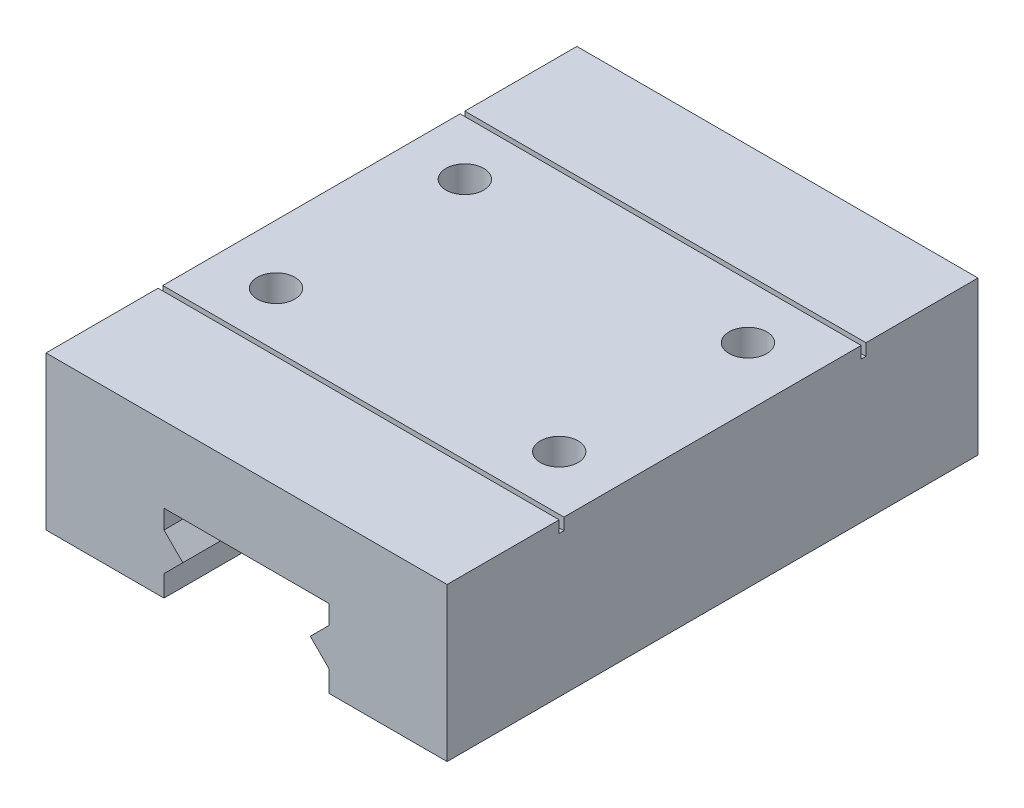
ISO-10303-21;
HEADER;
FILE_DESCRIPTION(('STEP AP214'),'2;1');
FILE_NAME('part.step','',(''),(''),'','','');
FILE_SCHEMA(('AUTOMOTIVE_DESIGN { 1 0 10303 214 1 1 1 1 }'));
ENDSEC;
DATA;
#1=APPLICATION_CONTEXT('core data for automotive mechanical design processes');
#2=APPLICATION_PROTOCOL_DEFINITION('international standard','automotive_design',2000,#1);
#3=PRODUCT_CONTEXT('',#1,'mechanical');
#4=PRODUCT('Part','Part','',(#3));
#5=PRODUCT_RELATED_PRODUCT_CATEGORY('part','',(#4));
#6=PRODUCT_DEFINITION_FORMATION('','',#4);
#7=PRODUCT_DEFINITION_CONTEXT('part definition',#1,'design');
#8=PRODUCT_DEFINITION('design','',#6,#7);
#9=PRODUCT_DEFINITION_SHAPE('','',#8);
#10=(LENGTH_UNIT() NAMED_UNIT(*) SI_UNIT(.MILLI.,.METRE.));
#11=(NAMED_UNIT(*) PLANE_ANGLE_UNIT() SI_UNIT($,.RADIAN.));
#12=(NAMED_UNIT(*) SI_UNIT($,.STERADIAN.) SOLID_ANGLE_UNIT());
#13=UNCERTAINTY_MEASURE_WITH_UNIT(LENGTH_MEASURE(1.E-05),#10,'distance_accuracy_value','');
#14=(GEOMETRIC_REPRESENTATION_CONTEXT(3) GLOBAL_UNCERTAINTY_ASSIGNED_CONTEXT((#13)) GLOBAL_UNIT_ASSIGNED_CONTEXT((#10,
#11,#12)) REPRESENTATION_CONTEXT('',''));
#15=CARTESIAN_POINT('',(0.,0.,0.));
#16=DIRECTION('',(0.,0.,1.));
#17=DIRECTION('',(1.,0.,0.));
#18=AXIS2_PLACEMENT_3D('',#15,#16,#17);
#19=CARTESIAN_POINT('',(-8.5,0.,22.5));
#20=DIRECTION('',(0.,-1.,0.));
#21=DIRECTION('',(1.,0.,0.));
#22=AXIS2_PLACEMENT_3D('',#19,#20,#21);
#23=PLANE('',#22);
#24=DIRECTION('',(0.,0.,-1.));
#25=VECTOR('',#24,1.);
#26=CARTESIAN_POINT('',(8.5,0.,22.5));
#27=LINE('',#26,#25);
#28=CARTESIAN_POINT('',(8.5,0.,22.5));
#29=VERTEX_POINT('',#28);
#30=CARTESIAN_POINT('',(8.5,0.,17.75));
#31=VERTEX_POINT('',#30);
#32=EDGE_CURVE('E11',#29,#31,#27,.T.);
#33=ORIENTED_EDGE('',*,*,#32,.T.);
#34=DIRECTION('',(1.,0.,0.));
#35=VECTOR('',#34,1.);
#36=CARTESIAN_POINT('',(-8.5,0.,17.75));
#37=LINE('',#36,#35);
#38=CARTESIAN_POINT('',(-8.5,0.,17.75));
#39=VERTEX_POINT('',#38);
#40=EDGE_CURVE('E233',#39,#31,#37,.T.);
#41=ORIENTED_EDGE('',*,*,#40,.F.);
#42=DIRECTION('',(0.,0.,-1.));
#43=VECTOR('',#42,1.);
#44=CARTESIAN_POINT('',(-8.5,0.,22.5));
#45=LINE('',#44,#43);
#46=CARTESIAN_POINT('',(-8.5,0.,22.5));
#47=VERTEX_POINT('',#46);
#48=EDGE_CURVE('E374',#47,#39,#45,.T.);
#49=ORIENTED_EDGE('',*,*,#48,.F.);
#50=DIRECTION('',(-1.,0.,0.));
#51=VECTOR('',#50,1.);
#52=CARTESIAN_POINT('',(-8.5,0.,22.5));
#53=LINE('',#52,#51);
#54=EDGE_CURVE('E283',#29,#47,#53,.T.);
#55=ORIENTED_EDGE('',*,*,#54,.F.);
#56=EDGE_LOOP('',(#33,#41,#49,#55));
#57=FACE_BOUND('',#56,.T.);
#58=ADVANCED_FACE('F38',(#57),#23,.F.);
#59=CARTESIAN_POINT('',(-8.5,0.,4.75));
#60=VERTEX_POINT('',#59);
#61=CARTESIAN_POINT('',(-8.5,0.,0.));
#62=VERTEX_POINT('',#61);
#63=EDGE_CURVE('E373',#60,#62,#45,.T.);
#64=ORIENTED_EDGE('',*,*,#63,.F.);
#65=DIRECTION('',(-1.,0.,0.));
#66=VECTOR('',#65,1.);
#67=CARTESIAN_POINT('',(-8.5,0.,4.75));
#68=LINE('',#67,#66);
#69=CARTESIAN_POINT('',(8.5,0.,4.75));
#70=VERTEX_POINT('',#69);
#71=EDGE_CURVE('E259',#70,#60,#68,.T.);
#72=ORIENTED_EDGE('',*,*,#71,.F.);
#73=CARTESIAN_POINT('',(8.5,0.,0.));
#74=VERTEX_POINT('',#73);
#75=EDGE_CURVE('E47',#70,#74,#27,.T.);
#76=ORIENTED_EDGE('',*,*,#75,.T.);
#77=DIRECTION('',(-1.,0.,0.));
#78=VECTOR('',#77,1.);
#79=CARTESIAN_POINT('',(-8.5,0.,0.));
#80=LINE('',#79,#78);
#81=EDGE_CURVE('E313',#74,#62,#80,.T.);
#82=ORIENTED_EDGE('',*,*,#81,.T.);
#83=EDGE_LOOP('',(#64,#72,#76,#82));
#84=FACE_BOUND('',#83,.T.);
#85=ADVANCED_FACE('F389',(#84),#23,.F.);
#86=CARTESIAN_POINT('',(8.5,0.,22.5));
#87=DIRECTION('',(-1.,0.,0.));
#88=DIRECTION('',(0.,-1.,0.));
#89=AXIS2_PLACEMENT_3D('',#86,#87,#88);
#90=PLANE('',#89);
#91=DIRECTION('',(0.,0.,-1.));
#92=VECTOR('',#91,1.);
#93=CARTESIAN_POINT('',(8.5,-0.5,17.75));
#94=LINE('',#93,#92);
#95=CARTESIAN_POINT('',(8.5,-0.5,17.75));
#96=VERTEX_POINT('',#95);
#97=CARTESIAN_POINT('',(8.5,-0.5,17.55));
#98=VERTEX_POINT('',#97);
#99=EDGE_CURVE('E237',#96,#98,#94,.T.);
#100=ORIENTED_EDGE('',*,*,#99,.F.);
#101=DIRECTION('',(0.,1.,0.));
#102=VECTOR('',#101,1.);
#103=CARTESIAN_POINT('',(8.5,-0.5,17.75));
#104=LINE('',#103,#102);
#105=EDGE_CURVE('E243',#96,#31,#104,.T.);
#106=ORIENTED_EDGE('',*,*,#105,.T.);
#107=ORIENTED_EDGE('',*,*,#32,.F.);
#108=DIRECTION('',(0.,1.,0.));
#109=VECTOR('',#108,1.);
#110=CARTESIAN_POINT('',(8.5,0.,22.5));
#111=LINE('',#110,#109);
#112=CARTESIAN_POINT('',(8.5,-6.5,22.5));
#113=VERTEX_POINT('',#112);
#114=EDGE_CURVE('E280',#113,#29,#111,.T.);
#115=ORIENTED_EDGE('',*,*,#114,.F.);
#116=DIRECTION('',(0.,0.,-1.));
#117=VECTOR('',#116,1.);
#118=CARTESIAN_POINT('',(8.5,-6.5,22.5));
#119=LINE('',#118,#117);
#120=CARTESIAN_POINT('',(8.5,-6.5,0.));
#121=VERTEX_POINT('',#120);
#122=EDGE_CURVE('E310',#113,#121,#119,.T.);
#123=ORIENTED_EDGE('',*,*,#122,.T.);
#124=DIRECTION('',(0.,1.,0.));
#125=VECTOR('',#124,1.);
#126=CARTESIAN_POINT('',(8.5,0.,0.));
#127=LINE('',#126,#125);
#128=EDGE_CURVE('E272',#121,#74,#127,.T.);
#129=ORIENTED_EDGE('',*,*,#128,.T.);
#130=ORIENTED_EDGE('',*,*,#75,.F.);
#131=DIRECTION('',(0.,1.,0.));
#132=VECTOR('',#131,1.);
#133=CARTESIAN_POINT('',(8.5,-0.5,4.75));
#134=LINE('',#133,#132);
#135=CARTESIAN_POINT('',(8.5,-0.5,4.75));
#136=VERTEX_POINT('',#135);
#137=EDGE_CURVE('E273',#136,#70,#134,.T.);
#138=ORIENTED_EDGE('',*,*,#137,.F.);
#139=DIRECTION('',(0.,0.,-1.));
#140=VECTOR('',#139,1.);
#141=CARTESIAN_POINT('',(8.5,-0.5,4.75));
#142=LINE('',#141,#140);
#143=CARTESIAN_POINT('',(8.5,-0.5,4.95));
#144=VERTEX_POINT('',#143);
#145=EDGE_CURVE('E262',#144,#136,#142,.T.);
#146=ORIENTED_EDGE('',*,*,#145,.F.);
#147=DIRECTION('',(0.,1.,0.));
#148=VECTOR('',#147,1.);
#149=CARTESIAN_POINT('',(8.5,-0.5,4.95));
#150=LINE('',#149,#148);
#151=CARTESIAN_POINT('',(8.5,0.,4.95));
#152=VERTEX_POINT('',#151);
#153=EDGE_CURVE('E275',#144,#152,#150,.T.);
#154=ORIENTED_EDGE('',*,*,#153,.T.);
#155=CARTESIAN_POINT('',(8.5,0.,17.55));
#156=VERTEX_POINT('',#155);
#157=EDGE_CURVE('E46',#156,#152,#27,.T.);
#158=ORIENTED_EDGE('',*,*,#157,.F.);
#159=DIRECTION('',(0.,1.,0.));
#160=VECTOR('',#159,1.);
#161=CARTESIAN_POINT('',(8.5,-0.5,17.55));
#162=LINE('',#161,#160);
#163=EDGE_CURVE('E252',#98,#156,#162,.T.);
#164=ORIENTED_EDGE('',*,*,#163,.F.);
#165=EDGE_LOOP('',(#100,#106,#107,#115,#123,#129,#130,#138,#146,#154,#158,#164));
#166=FACE_BOUND('',#165,.T.);
#167=ADVANCED_FACE('F40',(#166),#90,.F.);
#168=CARTESIAN_POINT('',(-6.,0.,7.25));
#169=DIRECTION('',(0.,1.,0.));
#170=DIRECTION('',(0.,0.,1.));
#171=AXIS2_PLACEMENT_3D('',#168,#169,#170);
#172=CIRCLE('',#171,0.799999999999999);
#173=CARTESIAN_POINT('',(-6.,0.,8.05));
#174=VERTEX_POINT('',#173);
#175=EDGE_CURVE('E211',#174,#174,#172,.T.);
#176=ORIENTED_EDGE('',*,*,#175,.F.);
#177=EDGE_LOOP('',(#176));
#178=FACE_BOUND('',#177,.T.);
#179=CARTESIAN_POINT('',(6.,0.,7.25));
#180=DIRECTION('',(0.,1.,0.));
#181=DIRECTION('',(0.,0.,1.));
#182=AXIS2_PLACEMENT_3D('',#179,#180,#181);
#183=CIRCLE('',#182,0.799999999999999);
#184=CARTESIAN_POINT('',(6.,0.,8.05));
#185=VERTEX_POINT('',#184);
#186=EDGE_CURVE('E210',#185,#185,#183,.T.);
#187=ORIENTED_EDGE('',*,*,#186,.F.);
#188=EDGE_LOOP('',(#187));
#189=FACE_BOUND('',#188,.T.);
#190=CARTESIAN_POINT('',(6.,0.,15.25));
#191=DIRECTION('',(0.,1.,0.));
#192=DIRECTION('',(0.,0.,1.));
#193=AXIS2_PLACEMENT_3D('',#190,#191,#192);
#194=CIRCLE('',#193,0.799999999999999);
#195=CARTESIAN_POINT('',(6.,0.,16.05));
#196=VERTEX_POINT('',#195);
#197=EDGE_CURVE('E221',#196,#196,#194,.T.);
#198=ORIENTED_EDGE('',*,*,#197,.F.);
#199=EDGE_LOOP('',(#198));
#200=FACE_BOUND('',#199,.T.);
#201=CARTESIAN_POINT('',(-6.,0.,15.25));
#202=DIRECTION('',(0.,1.,0.));
#203=DIRECTION('',(0.,0.,1.));
#204=AXIS2_PLACEMENT_3D('',#201,#202,#203);
#205=CIRCLE('',#204,0.799999999999999);
#206=CARTESIAN_POINT('',(-6.,0.,16.05));
#207=VERTEX_POINT('',#206);
#208=EDGE_CURVE('E227',#207,#207,#205,.T.);
#209=ORIENTED_EDGE('',*,*,#208,.F.);
#210=EDGE_LOOP('',(#209));
#211=FACE_BOUND('',#210,.T.);
#212=CARTESIAN_POINT('',(-8.5,0.,17.55));
#213=VERTEX_POINT('',#212);
#214=CARTESIAN_POINT('',(-8.5,0.,4.95));
#215=VERTEX_POINT('',#214);
#216=EDGE_CURVE('E376',#213,#215,#45,.T.);
#217=ORIENTED_EDGE('',*,*,#216,.F.);
#218=DIRECTION('',(-1.,0.,0.));
#219=VECTOR('',#218,1.);
#220=CARTESIAN_POINT('',(-8.5,0.,17.55));
#221=LINE('',#220,#219);
#222=EDGE_CURVE('E238',#156,#213,#221,.T.);
#223=ORIENTED_EDGE('',*,*,#222,.F.);
#224=ORIENTED_EDGE('',*,*,#157,.T.);
#225=DIRECTION('',(1.,0.,0.));
#226=VECTOR('',#225,1.);
#227=CARTESIAN_POINT('',(-8.5,0.,4.95));
#228=LINE('',#227,#226);
#229=EDGE_CURVE('E248',#215,#152,#228,.T.);
#230=ORIENTED_EDGE('',*,*,#229,.F.);
#231=EDGE_LOOP('',(#217,#223,#224,#230));
#232=FACE_BOUND('',#231,.T.);
#233=ADVANCED_FACE('F427',(#178,#189,#200,#211,#232),#23,.F.);
#234=CARTESIAN_POINT('',(-8.5,0.,22.5));
#235=DIRECTION('',(1.,0.,0.));
#236=DIRECTION('',(0.,1.,0.));
#237=AXIS2_PLACEMENT_3D('',#234,#235,#236);
#238=PLANE('',#237);
#239=ORIENTED_EDGE('',*,*,#48,.T.);
#240=DIRECTION('',(0.,1.,0.));
#241=VECTOR('',#240,1.);
#242=CARTESIAN_POINT('',(-8.5,-0.5,17.75));
#243=LINE('',#242,#241);
#244=CARTESIAN_POINT('',(-8.5,-0.5,17.75));
#245=VERTEX_POINT('',#244);
#246=EDGE_CURVE('E246',#245,#39,#243,.T.);
#247=ORIENTED_EDGE('',*,*,#246,.F.);
#248=DIRECTION('',(0.,0.,1.));
#249=VECTOR('',#248,1.);
#250=CARTESIAN_POINT('',(-8.5,-0.5,17.75));
#251=LINE('',#250,#249);
#252=CARTESIAN_POINT('',(-8.5,-0.5,17.55));
#253=VERTEX_POINT('',#252);
#254=EDGE_CURVE('E241',#253,#245,#251,.T.);
#255=ORIENTED_EDGE('',*,*,#254,.F.);
#256=DIRECTION('',(0.,1.,0.));
#257=VECTOR('',#256,1.);
#258=CARTESIAN_POINT('',(-8.5,-0.5,17.55));
#259=LINE('',#258,#257);
#260=EDGE_CURVE('E249',#253,#213,#259,.T.);
#261=ORIENTED_EDGE('',*,*,#260,.T.);
#262=ORIENTED_EDGE('',*,*,#216,.T.);
#263=DIRECTION('',(0.,1.,0.));
#264=VECTOR('',#263,1.);
#265=CARTESIAN_POINT('',(-8.5,-0.5,4.95));
#266=LINE('',#265,#264);
#267=CARTESIAN_POINT('',(-8.5,-0.5,4.95));
#268=VERTEX_POINT('',#267);
#269=EDGE_CURVE('E265',#268,#215,#266,.T.);
#270=ORIENTED_EDGE('',*,*,#269,.F.);
#271=DIRECTION('',(0.,0.,1.));
#272=VECTOR('',#271,1.);
#273=CARTESIAN_POINT('',(-8.5,-0.5,4.75));
#274=LINE('',#273,#272);
#275=CARTESIAN_POINT('',(-8.5,-0.5,4.75));
#276=VERTEX_POINT('',#275);
#277=EDGE_CURVE('E256',#276,#268,#274,.T.);
#278=ORIENTED_EDGE('',*,*,#277,.F.);
#279=DIRECTION('',(0.,1.,0.));
#280=VECTOR('',#279,1.);
#281=CARTESIAN_POINT('',(-8.5,-0.5,4.75));
#282=LINE('',#281,#280);
#283=EDGE_CURVE('E269',#276,#60,#282,.T.);
#284=ORIENTED_EDGE('',*,*,#283,.T.);
#285=ORIENTED_EDGE('',*,*,#63,.T.);
#286=DIRECTION('',(0.,-1.,0.));
#287=VECTOR('',#286,1.);
#288=CARTESIAN_POINT('',(-8.5,0.,0.));
#289=LINE('',#288,#287);
#290=CARTESIAN_POINT('',(-8.5,-6.5,0.));
#291=VERTEX_POINT('',#290);
#292=EDGE_CURVE('E316',#62,#291,#289,.T.);
#293=ORIENTED_EDGE('',*,*,#292,.T.);
#294=DIRECTION('',(0.,0.,-1.));
#295=VECTOR('',#294,1.);
#296=CARTESIAN_POINT('',(-8.5,-6.5,22.5));
#297=LINE('',#296,#295);
#298=CARTESIAN_POINT('',(-8.5,-6.5,22.5));
#299=VERTEX_POINT('',#298);
#300=EDGE_CURVE('E371',#299,#291,#297,.T.);
#301=ORIENTED_EDGE('',*,*,#300,.F.);
#302=DIRECTION('',(0.,-1.,0.));
#303=VECTOR('',#302,1.);
#304=CARTESIAN_POINT('',(-8.5,0.,22.5));
#305=LINE('',#304,#303);
#306=EDGE_CURVE('E286',#47,#299,#305,.T.);
#307=ORIENTED_EDGE('',*,*,#306,.F.);
#308=EDGE_LOOP('',(#239,#247,#255,#261,#262,#270,#278,#284,#285,#293,#301,#307));
#309=FACE_BOUND('',#308,.T.);
#310=ADVANCED_FACE('F382',(#309),#238,.F.);
#311=CARTESIAN_POINT('',(-8.5,-6.5,22.5));
#312=DIRECTION('',(0.,1.,0.));
#313=DIRECTION('',(-1.,0.,0.));
#314=AXIS2_PLACEMENT_3D('',#311,#312,#313);
#315=PLANE('',#314);
#316=DIRECTION('',(1.,0.,0.));
#317=VECTOR('',#316,1.);
#318=CARTESIAN_POINT('',(-8.5,-6.5,0.));
#319=LINE('',#318,#317);
#320=CARTESIAN_POINT('',(-3.5,-6.5,0.));
#321=VERTEX_POINT('',#320);
#322=EDGE_CURVE('E318',#291,#321,#319,.T.);
#323=ORIENTED_EDGE('',*,*,#322,.T.);
#324=DIRECTION('',(0.,0.,-1.));
#325=VECTOR('',#324,1.);
#326=CARTESIAN_POINT('',(-3.5,-6.5,22.5));
#327=LINE('',#326,#325);
#328=CARTESIAN_POINT('',(-3.5,-6.5,22.5));
#329=VERTEX_POINT('',#328);
#330=EDGE_CURVE('E368',#329,#321,#327,.T.);
#331=ORIENTED_EDGE('',*,*,#330,.F.);
#332=DIRECTION('',(1.,0.,0.));
#333=VECTOR('',#332,1.);
#334=CARTESIAN_POINT('',(-8.5,-6.5,22.5));
#335=LINE('',#334,#333);
#336=EDGE_CURVE('E288',#299,#329,#335,.T.);
#337=ORIENTED_EDGE('',*,*,#336,.F.);
#338=ORIENTED_EDGE('',*,*,#300,.T.);
#339=EDGE_LOOP('',(#323,#331,#337,#338));
#340=FACE_BOUND('',#339,.T.);
#341=ADVANCED_FACE('F399',(#340),#315,.F.);
#342=CARTESIAN_POINT('',(-3.5,-6.5,22.5));
#343=DIRECTION('',(-1.,0.,0.));
#344=DIRECTION('',(0.,-1.,0.));
#345=AXIS2_PLACEMENT_3D('',#342,#343,#344);
#346=PLANE('',#345);
#347=DIRECTION('',(0.,1.,0.));
#348=VECTOR('',#347,1.);
#349=CARTESIAN_POINT('',(-3.5,-6.5,0.));
#350=LINE('',#349,#348);
#351=CARTESIAN_POINT('',(-3.5,-5.6,0.));
#352=VERTEX_POINT('',#351);
#353=EDGE_CURVE('E320',#321,#352,#350,.T.);
#354=ORIENTED_EDGE('',*,*,#353,.T.);
#355=DIRECTION('',(0.,0.,-1.));
#356=VECTOR('',#355,1.);
#357=CARTESIAN_POINT('',(-3.5,-5.6,22.5));
#358=LINE('',#357,#356);
#359=CARTESIAN_POINT('',(-3.5,-5.6,22.5));
#360=VERTEX_POINT('',#359);
#361=EDGE_CURVE('E365',#360,#352,#358,.T.);
#362=ORIENTED_EDGE('',*,*,#361,.F.);
#363=DIRECTION('',(0.,1.,0.));
#364=VECTOR('',#363,1.);
#365=CARTESIAN_POINT('',(-3.5,-6.5,22.5));
#366=LINE('',#365,#364);
#367=EDGE_CURVE('E290',#329,#360,#366,.T.);
#368=ORIENTED_EDGE('',*,*,#367,.F.);
#369=ORIENTED_EDGE('',*,*,#330,.T.);
#370=EDGE_LOOP('',(#354,#362,#368,#369));
#371=FACE_BOUND('',#370,.T.);
#372=ADVANCED_FACE('F403',(#371),#346,.F.);
#373=CARTESIAN_POINT('',(-3.5,-5.6,22.5));
#374=DIRECTION('',(-0.707106781186546,0.707106781186548,0.));
#375=DIRECTION('',(-0.707106781186548,-0.707106781186547,0.));
#376=AXIS2_PLACEMENT_3D('',#373,#374,#375);
#377=PLANE('',#376);
#378=DIRECTION('',(0.707106781186548,0.707106781186546,0.));
#379=VECTOR('',#378,1.);
#380=CARTESIAN_POINT('',(-3.5,-5.6,0.));
#381=LINE('',#380,#379);
#382=CARTESIAN_POINT('',(-2.7,-4.8,0.));
#383=VERTEX_POINT('',#382);
#384=EDGE_CURVE('E322',#352,#383,#381,.T.);
#385=ORIENTED_EDGE('',*,*,#384,.T.);
#386=DIRECTION('',(0.,0.,-1.));
#387=VECTOR('',#386,1.);
#388=CARTESIAN_POINT('',(-2.7,-4.8,22.5));
#389=LINE('',#388,#387);
#390=CARTESIAN_POINT('',(-2.7,-4.8,22.5));
#391=VERTEX_POINT('',#390);
#392=EDGE_CURVE('E362',#391,#383,#389,.T.);
#393=ORIENTED_EDGE('',*,*,#392,.F.);
#394=DIRECTION('',(0.707106781186548,0.707106781186546,0.));
#395=VECTOR('',#394,1.);
#396=CARTESIAN_POINT('',(-3.5,-5.6,22.5));
#397=LINE('',#396,#395);
#398=EDGE_CURVE('E292',#360,#391,#397,.T.);
#399=ORIENTED_EDGE('',*,*,#398,.F.);
#400=ORIENTED_EDGE('',*,*,#361,.T.);
#401=EDGE_LOOP('',(#385,#393,#399,#400));
#402=FACE_BOUND('',#401,.T.);
#403=ADVANCED_FACE('F476',(#402),#377,.F.);
#404=CARTESIAN_POINT('',(-2.7,-4.8,22.5));
#405=DIRECTION('',(-0.707106781186549,-0.707106781186546,0.));
#406=DIRECTION('',(0.707106781186546,-0.707106781186549,0.));
#407=AXIS2_PLACEMENT_3D('',#404,#405,#406);
#408=PLANE('',#407);
#409=DIRECTION('',(-0.707106781186546,0.707106781186549,0.));
#410=VECTOR('',#409,1.);
#411=CARTESIAN_POINT('',(-2.7,-4.8,0.));
#412=LINE('',#411,#410);
#413=CARTESIAN_POINT('',(-3.5,-4.,0.));
#414=VERTEX_POINT('',#413);
#415=EDGE_CURVE('E324',#383,#414,#412,.T.);
#416=ORIENTED_EDGE('',*,*,#415,.T.);
#417=DIRECTION('',(0.,0.,-1.));
#418=VECTOR('',#417,1.);
#419=CARTESIAN_POINT('',(-3.5,-4.,22.5));
#420=LINE('',#419,#418);
#421=CARTESIAN_POINT('',(-3.5,-4.,22.5));
#422=VERTEX_POINT('',#421);
#423=EDGE_CURVE('E359',#422,#414,#420,.T.);
#424=ORIENTED_EDGE('',*,*,#423,.F.);
#425=DIRECTION('',(-0.707106781186546,0.707106781186549,0.));
#426=VECTOR('',#425,1.);
#427=CARTESIAN_POINT('',(-2.7,-4.8,22.5));
#428=LINE('',#427,#426);
#429=EDGE_CURVE('E294',#391,#422,#428,.T.);
#430=ORIENTED_EDGE('',*,*,#429,.F.);
#431=ORIENTED_EDGE('',*,*,#392,.T.);
#432=EDGE_LOOP('',(#416,#424,#430,#431));
#433=FACE_BOUND('',#432,.T.);
#434=ADVANCED_FACE('F474',(#433),#408,.F.);
#435=CARTESIAN_POINT('',(-3.5,-4.,22.5));
#436=DIRECTION('',(-1.,0.,0.));
#437=DIRECTION('',(0.,0.,1.));
#438=AXIS2_PLACEMENT_3D('',#435,#436,#437);
#439=PLANE('',#438);
#440=DIRECTION('',(0.,1.,0.));
#441=VECTOR('',#440,1.);
#442=CARTESIAN_POINT('',(-3.5,-4.,0.));
#443=LINE('',#442,#441);
#444=CARTESIAN_POINT('',(-3.5,-3.2,0.));
#445=VERTEX_POINT('',#444);
#446=EDGE_CURVE('E326',#414,#445,#443,.T.);
#447=ORIENTED_EDGE('',*,*,#446,.T.);
#448=DIRECTION('',(0.,0.,-1.));
#449=VECTOR('',#448,1.);
#450=CARTESIAN_POINT('',(-3.5,-3.2,22.5));
#451=LINE('',#450,#449);
#452=CARTESIAN_POINT('',(-3.5,-3.2,22.5));
#453=VERTEX_POINT('',#452);
#454=EDGE_CURVE('E356',#453,#445,#451,.T.);
#455=ORIENTED_EDGE('',*,*,#454,.F.);
#456=DIRECTION('',(0.,1.,0.));
#457=VECTOR('',#456,1.);
#458=CARTESIAN_POINT('',(-3.5,-4.,22.5));
#459=LINE('',#458,#457);
#460=EDGE_CURVE('E296',#422,#453,#459,.T.);
#461=ORIENTED_EDGE('',*,*,#460,.F.);
#462=ORIENTED_EDGE('',*,*,#423,.T.);
#463=EDGE_LOOP('',(#447,#455,#461,#462));
#464=FACE_BOUND('',#463,.T.);
#465=ADVANCED_FACE('F469',(#464),#439,.F.);
#466=CARTESIAN_POINT('',(3.5,-3.2,22.5));
#467=DIRECTION('',(0.,1.,0.));
#468=DIRECTION('',(-1.,0.,0.));
#469=AXIS2_PLACEMENT_3D('',#466,#467,#468);
#470=PLANE('',#469);
#471=DIRECTION('',(1.,0.,0.));
#472=VECTOR('',#471,1.);
#473=CARTESIAN_POINT('',(3.5,-3.2,0.));
#474=LINE('',#473,#472);
#475=CARTESIAN_POINT('',(3.5,-3.2,0.));
#476=VERTEX_POINT('',#475);
#477=EDGE_CURVE('E328',#445,#476,#474,.T.);
#478=ORIENTED_EDGE('',*,*,#477,.T.);
#479=DIRECTION('',(0.,0.,-1.));
#480=VECTOR('',#479,1.);
#481=CARTESIAN_POINT('',(3.5,-3.2,22.5));
#482=LINE('',#481,#480);
#483=CARTESIAN_POINT('',(3.5,-3.2,22.5));
#484=VERTEX_POINT('',#483);
#485=EDGE_CURVE('E353',#484,#476,#482,.T.);
#486=ORIENTED_EDGE('',*,*,#485,.F.);
#487=DIRECTION('',(1.,0.,0.));
#488=VECTOR('',#487,1.);
#489=CARTESIAN_POINT('',(3.5,-3.2,22.5));
#490=LINE('',#489,#488);
#491=EDGE_CURVE('E298',#453,#484,#490,.T.);
#492=ORIENTED_EDGE('',*,*,#491,.F.);
#493=ORIENTED_EDGE('',*,*,#454,.T.);
#494=EDGE_LOOP('',(#478,#486,#492,#493));
#495=FACE_BOUND('',#494,.T.);
#496=ADVANCED_FACE('F464',(#495),#470,.F.);
#497=CARTESIAN_POINT('',(3.5,-4.,22.5));
#498=DIRECTION('',(1.,0.,0.));
#499=DIRECTION('',(0.,0.,-1.));
#500=AXIS2_PLACEMENT_3D('',#497,#498,#499);
#501=PLANE('',#500);
#502=DIRECTION('',(0.,-1.,0.));
#503=VECTOR('',#502,1.);
#504=CARTESIAN_POINT('',(3.5,-4.,0.));
#505=LINE('',#504,#503);
#506=CARTESIAN_POINT('',(3.5,-4.,0.));
#507=VERTEX_POINT('',#506);
#508=EDGE_CURVE('E330',#476,#507,#505,.T.);
#509=ORIENTED_EDGE('',*,*,#508,.T.);
#510=DIRECTION('',(0.,0.,-1.));
#511=VECTOR('',#510,1.);
#512=CARTESIAN_POINT('',(3.5,-4.,22.5));
#513=LINE('',#512,#511);
#514=CARTESIAN_POINT('',(3.5,-4.,22.5));
#515=VERTEX_POINT('',#514);
#516=EDGE_CURVE('E350',#515,#507,#513,.T.);
#517=ORIENTED_EDGE('',*,*,#516,.F.);
#518=DIRECTION('',(0.,-1.,0.));
#519=VECTOR('',#518,1.);
#520=CARTESIAN_POINT('',(3.5,-4.,22.5));
#521=LINE('',#520,#519);
#522=EDGE_CURVE('E300',#484,#515,#521,.T.);
#523=ORIENTED_EDGE('',*,*,#522,.F.);
#524=ORIENTED_EDGE('',*,*,#485,.T.);
#525=EDGE_LOOP('',(#509,#517,#523,#524));
#526=FACE_BOUND('',#525,.T.);
#527=ADVANCED_FACE('F460',(#526),#501,.F.);
#528=CARTESIAN_POINT('',(2.7,-4.8,22.5));
#529=DIRECTION('',(0.707106781186549,-0.707106781186546,0.));
#530=DIRECTION('',(0.707106781186546,0.707106781186549,0.));
#531=AXIS2_PLACEMENT_3D('',#528,#529,#530);
#532=PLANE('',#531);
#533=DIRECTION('',(-0.707106781186546,-0.707106781186549,0.));
#534=VECTOR('',#533,1.);
#535=CARTESIAN_POINT('',(2.7,-4.8,0.));
#536=LINE('',#535,#534);
#537=CARTESIAN_POINT('',(2.7,-4.8,0.));
#538=VERTEX_POINT('',#537);
#539=EDGE_CURVE('E332',#507,#538,#536,.T.);
#540=ORIENTED_EDGE('',*,*,#539,.T.);
#541=DIRECTION('',(0.,0.,-1.));
#542=VECTOR('',#541,1.);
#543=CARTESIAN_POINT('',(2.7,-4.8,22.5));
#544=LINE('',#543,#542);
#545=CARTESIAN_POINT('',(2.7,-4.8,22.5));
#546=VERTEX_POINT('',#545);
#547=EDGE_CURVE('E347',#546,#538,#544,.T.);
#548=ORIENTED_EDGE('',*,*,#547,.F.);
#549=DIRECTION('',(-0.707106781186546,-0.707106781186549,0.));
#550=VECTOR('',#549,1.);
#551=CARTESIAN_POINT('',(2.7,-4.8,22.5));
#552=LINE('',#551,#550);
#553=EDGE_CURVE('E302',#515,#546,#552,.T.);
#554=ORIENTED_EDGE('',*,*,#553,.F.);
#555=ORIENTED_EDGE('',*,*,#516,.T.);
#556=EDGE_LOOP('',(#540,#548,#554,#555));
#557=FACE_BOUND('',#556,.T.);
#558=ADVANCED_FACE('F455',(#557),#532,.F.);
#559=CARTESIAN_POINT('',(3.5,-5.6,22.5));
#560=DIRECTION('',(0.707106781186546,0.707106781186549,0.));
#561=DIRECTION('',(-0.707106781186549,0.707106781186546,0.));
#562=AXIS2_PLACEMENT_3D('',#559,#560,#561);
#563=PLANE('',#562);
#564=DIRECTION('',(0.707106781186549,-0.707106781186546,0.));
#565=VECTOR('',#564,1.);
#566=CARTESIAN_POINT('',(3.5,-5.6,0.));
#567=LINE('',#566,#565);
#568=CARTESIAN_POINT('',(3.5,-5.6,0.));
#569=VERTEX_POINT('',#568);
#570=EDGE_CURVE('E334',#538,#569,#567,.T.);
#571=ORIENTED_EDGE('',*,*,#570,.T.);
#572=DIRECTION('',(0.,0.,-1.));
#573=VECTOR('',#572,1.);
#574=CARTESIAN_POINT('',(3.5,-5.6,22.5));
#575=LINE('',#574,#573);
#576=CARTESIAN_POINT('',(3.5,-5.6,22.5));
#577=VERTEX_POINT('',#576);
#578=EDGE_CURVE('E344',#577,#569,#575,.T.);
#579=ORIENTED_EDGE('',*,*,#578,.F.);
#580=DIRECTION('',(0.707106781186549,-0.707106781186546,0.));
#581=VECTOR('',#580,1.);
#582=CARTESIAN_POINT('',(3.5,-5.6,22.5));
#583=LINE('',#582,#581);
#584=EDGE_CURVE('E304',#546,#577,#583,.T.);
#585=ORIENTED_EDGE('',*,*,#584,.F.);
#586=ORIENTED_EDGE('',*,*,#547,.T.);
#587=EDGE_LOOP('',(#571,#579,#585,#586));
#588=FACE_BOUND('',#587,.T.);
#589=ADVANCED_FACE('F449',(#588),#563,.F.);
#590=CARTESIAN_POINT('',(3.5,-6.5,22.5));
#591=DIRECTION('',(1.,0.,0.));
#592=DIRECTION('',(0.,1.,0.));
#593=AXIS2_PLACEMENT_3D('',#590,#591,#592);
#594=PLANE('',#593);
#595=DIRECTION('',(0.,-1.,0.));
#596=VECTOR('',#595,1.);
#597=CARTESIAN_POINT('',(3.5,-6.5,0.));
#598=LINE('',#597,#596);
#599=CARTESIAN_POINT('',(3.5,-6.5,0.));
#600=VERTEX_POINT('',#599);
#601=EDGE_CURVE('E336',#569,#600,#598,.T.);
#602=ORIENTED_EDGE('',*,*,#601,.T.);
#603=DIRECTION('',(0.,0.,-1.));
#604=VECTOR('',#603,1.);
#605=CARTESIAN_POINT('',(3.5,-6.5,22.5));
#606=LINE('',#605,#604);
#607=CARTESIAN_POINT('',(3.5,-6.5,22.5));
#608=VERTEX_POINT('',#607);
#609=EDGE_CURVE('E341',#608,#600,#606,.T.);
#610=ORIENTED_EDGE('',*,*,#609,.F.);
#611=DIRECTION('',(0.,-1.,0.));
#612=VECTOR('',#611,1.);
#613=CARTESIAN_POINT('',(3.5,-6.5,22.5));
#614=LINE('',#613,#612);
#615=EDGE_CURVE('E306',#577,#608,#614,.T.);
#616=ORIENTED_EDGE('',*,*,#615,.F.);
#617=ORIENTED_EDGE('',*,*,#578,.T.);
#618=EDGE_LOOP('',(#602,#610,#616,#617));
#619=FACE_BOUND('',#618,.T.);
#620=ADVANCED_FACE('F445',(#619),#594,.F.);
#621=CARTESIAN_POINT('',(8.5,-6.5,22.5));
#622=DIRECTION('',(0.,1.,0.));
#623=DIRECTION('',(-1.,0.,0.));
#624=AXIS2_PLACEMENT_3D('',#621,#622,#623);
#625=PLANE('',#624);
#626=DIRECTION('',(1.,0.,0.));
#627=VECTOR('',#626,1.);
#628=CARTESIAN_POINT('',(8.5,-6.5,0.));
#629=LINE('',#628,#627);
#630=EDGE_CURVE('E284',#600,#121,#629,.T.);
#631=ORIENTED_EDGE('',*,*,#630,.T.);
#632=ORIENTED_EDGE('',*,*,#122,.F.);
#633=DIRECTION('',(1.,0.,0.));
#634=VECTOR('',#633,1.);
#635=CARTESIAN_POINT('',(8.5,-6.5,22.5));
#636=LINE('',#635,#634);
#637=EDGE_CURVE('E308',#608,#113,#636,.T.);
#638=ORIENTED_EDGE('',*,*,#637,.F.);
#639=ORIENTED_EDGE('',*,*,#609,.T.);
#640=EDGE_LOOP('',(#631,#632,#638,#639));
#641=FACE_BOUND('',#640,.T.);
#642=ADVANCED_FACE('F440',(#641),#625,.F.);
#643=CARTESIAN_POINT('',(0.,0.,22.5));
#644=DIRECTION('',(0.,0.,-1.));
#645=DIRECTION('',(-1.,0.,0.));
#646=AXIS2_PLACEMENT_3D('',#643,#644,#645);
#647=PLANE('',#646);
#648=ORIENTED_EDGE('',*,*,#114,.T.);
#649=ORIENTED_EDGE('',*,*,#54,.T.);
#650=ORIENTED_EDGE('',*,*,#306,.T.);
#651=ORIENTED_EDGE('',*,*,#336,.T.);
#652=ORIENTED_EDGE('',*,*,#367,.T.);
#653=ORIENTED_EDGE('',*,*,#398,.T.);
#654=ORIENTED_EDGE('',*,*,#429,.T.);
#655=ORIENTED_EDGE('',*,*,#460,.T.);
#656=ORIENTED_EDGE('',*,*,#491,.T.);
#657=ORIENTED_EDGE('',*,*,#522,.T.);
#658=ORIENTED_EDGE('',*,*,#553,.T.);
#659=ORIENTED_EDGE('',*,*,#584,.T.);
#660=ORIENTED_EDGE('',*,*,#615,.T.);
#661=ORIENTED_EDGE('',*,*,#637,.T.);
#662=EDGE_LOOP('',(#648,#649,#650,#651,#652,#653,#654,#655,#656,#657,#658,#659,#660,#661));
#663=FACE_BOUND('',#662,.T.);
#664=ADVANCED_FACE('F407',(#663),#647,.F.);
#665=CARTESIAN_POINT('',(0.,0.,0.));
#666=DIRECTION('',(0.,0.,-1.));
#667=DIRECTION('',(-1.,0.,0.));
#668=AXIS2_PLACEMENT_3D('',#665,#666,#667);
#669=PLANE('',#668);
#670=ORIENTED_EDGE('',*,*,#128,.F.);
#671=ORIENTED_EDGE('',*,*,#630,.F.);
#672=ORIENTED_EDGE('',*,*,#601,.F.);
#673=ORIENTED_EDGE('',*,*,#570,.F.);
#674=ORIENTED_EDGE('',*,*,#539,.F.);
#675=ORIENTED_EDGE('',*,*,#508,.F.);
#676=ORIENTED_EDGE('',*,*,#477,.F.);
#677=ORIENTED_EDGE('',*,*,#446,.F.);
#678=ORIENTED_EDGE('',*,*,#415,.F.);
#679=ORIENTED_EDGE('',*,*,#384,.F.);
#680=ORIENTED_EDGE('',*,*,#353,.F.);
#681=ORIENTED_EDGE('',*,*,#322,.F.);
#682=ORIENTED_EDGE('',*,*,#292,.F.);
#683=ORIENTED_EDGE('',*,*,#81,.F.);
#684=EDGE_LOOP('',(#670,#671,#672,#673,#674,#675,#676,#677,#678,#679,#680,#681,#682,#683));
#685=FACE_BOUND('',#684,.T.);
#686=ADVANCED_FACE('F394',(#685),#669,.T.);
#687=CARTESIAN_POINT('',(-8.5,-0.5,4.75));
#688=DIRECTION('',(0.,0.,-1.));
#689=DIRECTION('',(-1.,0.,0.));
#690=AXIS2_PLACEMENT_3D('',#687,#688,#689);
#691=PLANE('',#690);
#692=ORIENTED_EDGE('',*,*,#71,.T.);
#693=ORIENTED_EDGE('',*,*,#283,.F.);
#694=DIRECTION('',(-1.,0.,0.));
#695=VECTOR('',#694,1.);
#696=CARTESIAN_POINT('',(-8.5,-0.5,4.75));
#697=LINE('',#696,#695);
#698=EDGE_CURVE('E62',#136,#276,#697,.T.);
#699=ORIENTED_EDGE('',*,*,#698,.F.);
#700=ORIENTED_EDGE('',*,*,#137,.T.);
#701=EDGE_LOOP('',(#692,#693,#699,#700));
#702=FACE_BOUND('',#701,.T.);
#703=ADVANCED_FACE('F434',(#702),#691,.F.);
#704=CARTESIAN_POINT('',(-8.5,-0.5,4.95));
#705=DIRECTION('',(0.,0.,1.));
#706=DIRECTION('',(1.,0.,0.));
#707=AXIS2_PLACEMENT_3D('',#704,#705,#706);
#708=PLANE('',#707);
#709=ORIENTED_EDGE('',*,*,#229,.T.);
#710=ORIENTED_EDGE('',*,*,#153,.F.);
#711=DIRECTION('',(1.,0.,0.));
#712=VECTOR('',#711,1.);
#713=CARTESIAN_POINT('',(-8.5,-0.5,4.95));
#714=LINE('',#713,#712);
#715=EDGE_CURVE('E258',#268,#144,#714,.T.);
#716=ORIENTED_EDGE('',*,*,#715,.F.);
#717=ORIENTED_EDGE('',*,*,#269,.T.);
#718=EDGE_LOOP('',(#709,#710,#716,#717));
#719=FACE_BOUND('',#718,.T.);
#720=ADVANCED_FACE('F429',(#719),#708,.F.);
#721=CARTESIAN_POINT('',(0.,-0.5,0.));
#722=DIRECTION('',(0.,1.,0.));
#723=DIRECTION('',(0.,0.,1.));
#724=AXIS2_PLACEMENT_3D('',#721,#722,#723);
#725=PLANE('',#724);
#726=ORIENTED_EDGE('',*,*,#277,.T.);
#727=ORIENTED_EDGE('',*,*,#715,.T.);
#728=ORIENTED_EDGE('',*,*,#145,.T.);
#729=ORIENTED_EDGE('',*,*,#698,.T.);
#730=EDGE_LOOP('',(#726,#727,#728,#729));
#731=FACE_BOUND('',#730,.T.);
#732=ADVANCED_FACE('F432',(#731),#725,.T.);
#733=CARTESIAN_POINT('',(-8.5,-0.5,17.75));
#734=DIRECTION('',(0.,0.,1.));
#735=DIRECTION('',(1.,0.,0.));
#736=AXIS2_PLACEMENT_3D('',#733,#734,#735);
#737=PLANE('',#736);
#738=ORIENTED_EDGE('',*,*,#40,.T.);
#739=ORIENTED_EDGE('',*,*,#105,.F.);
#740=DIRECTION('',(1.,0.,0.));
#741=VECTOR('',#740,1.);
#742=CARTESIAN_POINT('',(-8.5,-0.5,17.75));
#743=LINE('',#742,#741);
#744=EDGE_CURVE('E234',#245,#96,#743,.T.);
#745=ORIENTED_EDGE('',*,*,#744,.F.);
#746=ORIENTED_EDGE('',*,*,#246,.T.);
#747=EDGE_LOOP('',(#738,#739,#745,#746));
#748=FACE_BOUND('',#747,.T.);
#749=ADVANCED_FACE('F414',(#748),#737,.F.);
#750=CARTESIAN_POINT('',(-8.5,-0.5,17.55));
#751=DIRECTION('',(0.,0.,-1.));
#752=DIRECTION('',(-1.,0.,0.));
#753=AXIS2_PLACEMENT_3D('',#750,#751,#752);
#754=PLANE('',#753);
#755=ORIENTED_EDGE('',*,*,#222,.T.);
#756=ORIENTED_EDGE('',*,*,#260,.F.);
#757=DIRECTION('',(-1.,0.,0.));
#758=VECTOR('',#757,1.);
#759=CARTESIAN_POINT('',(-8.5,-0.5,17.55));
#760=LINE('',#759,#758);
#761=EDGE_CURVE('E54',#98,#253,#760,.T.);
#762=ORIENTED_EDGE('',*,*,#761,.F.);
#763=ORIENTED_EDGE('',*,*,#163,.T.);
#764=EDGE_LOOP('',(#755,#756,#762,#763));
#765=FACE_BOUND('',#764,.T.);
#766=ADVANCED_FACE('F524',(#765),#754,.F.);
#767=CARTESIAN_POINT('',(0.,-0.5,0.));
#768=DIRECTION('',(0.,1.,0.));
#769=DIRECTION('',(0.,0.,1.));
#770=AXIS2_PLACEMENT_3D('',#767,#768,#769);
#771=PLANE('',#770);
#772=ORIENTED_EDGE('',*,*,#744,.T.);
#773=ORIENTED_EDGE('',*,*,#99,.T.);
#774=ORIENTED_EDGE('',*,*,#761,.T.);
#775=ORIENTED_EDGE('',*,*,#254,.T.);
#776=EDGE_LOOP('',(#772,#773,#774,#775));
#777=FACE_BOUND('',#776,.T.);
#778=ADVANCED_FACE('F419',(#777),#771,.T.);
#779=CARTESIAN_POINT('',(-6.,-4.2,15.25));
#780=DIRECTION('',(0.,1.,0.));
#781=DIRECTION('',(0.,0.,1.));
#782=AXIS2_PLACEMENT_3D('',#779,#780,#781);
#783=CONICAL_SURFACE('',#782,0.799999999999999,1.02974425867665);
#784=CARTESIAN_POINT('',(-6.,-4.68068849522205,15.25));
#785=VERTEX_POINT('',#784);
#786=VERTEX_LOOP('',#785);
#787=FACE_BOUND('',#786,.T.);
#788=CARTESIAN_POINT('',(-6.,-4.2,15.25));
#789=DIRECTION('',(0.,1.,0.));
#790=DIRECTION('',(0.,0.,1.));
#791=AXIS2_PLACEMENT_3D('',#788,#789,#790);
#792=CIRCLE('',#791,0.799999999999999);
#793=CARTESIAN_POINT('',(-6.,-4.2,16.05));
#794=VERTEX_POINT('',#793);
#795=EDGE_CURVE('E230',#794,#794,#792,.T.);
#796=ORIENTED_EDGE('',*,*,#795,.T.);
#797=EDGE_LOOP('',(#796));
#798=FACE_BOUND('',#797,.T.);
#799=ADVANCED_FACE('F507',(#787,#798),#783,.F.);
#800=CARTESIAN_POINT('',(-6.,0.,15.25));
#801=DIRECTION('',(0.,1.,0.));
#802=DIRECTION('',(0.,0.,1.));
#803=AXIS2_PLACEMENT_3D('',#800,#801,#802);
#804=CYLINDRICAL_SURFACE('',#803,0.799999999999999);
#805=ORIENTED_EDGE('',*,*,#795,.F.);
#806=EDGE_LOOP('',(#805));
#807=FACE_BOUND('',#806,.T.);
#808=ORIENTED_EDGE('',*,*,#208,.T.);
#809=EDGE_LOOP('',(#808));
#810=FACE_BOUND('',#809,.T.);
#811=ADVANCED_FACE('F504',(#807,#810),#804,.F.);
#812=CARTESIAN_POINT('',(6.,-4.2,15.25));
#813=DIRECTION('',(0.,1.,0.));
#814=DIRECTION('',(0.,0.,1.));
#815=AXIS2_PLACEMENT_3D('',#812,#813,#814);
#816=CONICAL_SURFACE('',#815,0.799999999999999,1.02974425867665);
#817=CARTESIAN_POINT('',(6.,-4.68068849522205,15.25));
#818=VERTEX_POINT('',#817);
#819=VERTEX_LOOP('',#818);
#820=FACE_BOUND('',#819,.T.);
#821=CARTESIAN_POINT('',(6.,-4.2,15.25));
#822=DIRECTION('',(0.,1.,0.));
#823=DIRECTION('',(0.,0.,1.));
#824=AXIS2_PLACEMENT_3D('',#821,#822,#823);
#825=CIRCLE('',#824,0.799999999999999);
#826=CARTESIAN_POINT('',(6.,-4.2,16.05));
#827=VERTEX_POINT('',#826);
#828=EDGE_CURVE('E224',#827,#827,#825,.T.);
#829=ORIENTED_EDGE('',*,*,#828,.T.);
#830=EDGE_LOOP('',(#829));
#831=FACE_BOUND('',#830,.T.);
#832=ADVANCED_FACE('F506',(#820,#831),#816,.F.);
#833=CARTESIAN_POINT('',(6.,0.,15.25));
#834=DIRECTION('',(0.,1.,0.));
#835=DIRECTION('',(0.,0.,1.));
#836=AXIS2_PLACEMENT_3D('',#833,#834,#835);
#837=CYLINDRICAL_SURFACE('',#836,0.799999999999999);
#838=ORIENTED_EDGE('',*,*,#828,.F.);
#839=EDGE_LOOP('',(#838));
#840=FACE_BOUND('',#839,.T.);
#841=ORIENTED_EDGE('',*,*,#197,.T.);
#842=EDGE_LOOP('',(#841));
#843=FACE_BOUND('',#842,.T.);
#844=ADVANCED_FACE('F514',(#840,#843),#837,.F.);
#845=CARTESIAN_POINT('',(6.,-4.2,7.25));
#846=DIRECTION('',(0.,1.,0.));
#847=DIRECTION('',(0.,0.,1.));
#848=AXIS2_PLACEMENT_3D('',#845,#846,#847);
#849=CONICAL_SURFACE('',#848,0.799999999999999,1.02974425867665);
#850=CARTESIAN_POINT('',(6.,-4.68068849522205,7.25));
#851=VERTEX_POINT('',#850);
#852=VERTEX_LOOP('',#851);
#853=FACE_BOUND('',#852,.T.);
#854=CARTESIAN_POINT('',(6.,-4.2,7.25));
#855=DIRECTION('',(0.,1.,0.));
#856=DIRECTION('',(0.,0.,1.));
#857=AXIS2_PLACEMENT_3D('',#854,#855,#856);
#858=CIRCLE('',#857,0.799999999999999);
#859=CARTESIAN_POINT('',(6.,-4.2,8.05));
#860=VERTEX_POINT('',#859);
#861=EDGE_CURVE('E214',#860,#860,#858,.T.);
#862=ORIENTED_EDGE('',*,*,#861,.T.);
#863=EDGE_LOOP('',(#862));
#864=FACE_BOUND('',#863,.T.);
#865=ADVANCED_FACE('F643',(#853,#864),#849,.F.);
#866=CARTESIAN_POINT('',(6.,0.,7.25));
#867=DIRECTION('',(0.,1.,0.));
#868=DIRECTION('',(0.,0.,1.));
#869=AXIS2_PLACEMENT_3D('',#866,#867,#868);
#870=CYLINDRICAL_SURFACE('',#869,0.799999999999999);
#871=ORIENTED_EDGE('',*,*,#861,.F.);
#872=EDGE_LOOP('',(#871));
#873=FACE_BOUND('',#872,.T.);
#874=ORIENTED_EDGE('',*,*,#186,.T.);
#875=EDGE_LOOP('',(#874));
#876=FACE_BOUND('',#875,.T.);
#877=ADVANCED_FACE('F204',(#873,#876),#870,.F.);
#878=CARTESIAN_POINT('',(-6.,-4.2,7.25));
#879=DIRECTION('',(0.,1.,0.));
#880=DIRECTION('',(0.,0.,1.));
#881=AXIS2_PLACEMENT_3D('',#878,#879,#880);
#882=CONICAL_SURFACE('',#881,0.799999999999999,1.02974425867665);
#883=CARTESIAN_POINT('',(-6.,-4.68068849522205,7.25));
#884=VERTEX_POINT('',#883);
#885=VERTEX_LOOP('',#884);
#886=FACE_BOUND('',#885,.T.);
#887=CARTESIAN_POINT('',(-6.,-4.2,7.25));
#888=DIRECTION('',(0.,1.,0.));
#889=DIRECTION('',(0.,0.,1.));
#890=AXIS2_PLACEMENT_3D('',#887,#888,#889);
#891=CIRCLE('',#890,0.799999999999999);
#892=CARTESIAN_POINT('',(-6.,-4.2,8.05));
#893=VERTEX_POINT('',#892);
#894=EDGE_CURVE('E208',#893,#893,#891,.T.);
#895=ORIENTED_EDGE('',*,*,#894,.T.);
#896=EDGE_LOOP('',(#895));
#897=FACE_BOUND('',#896,.T.);
#898=ADVANCED_FACE('F200',(#886,#897),#882,.F.);
#899=CARTESIAN_POINT('',(-6.,0.,7.25));
#900=DIRECTION('',(0.,1.,0.));
#901=DIRECTION('',(0.,0.,1.));
#902=AXIS2_PLACEMENT_3D('',#899,#900,#901);
#903=CYLINDRICAL_SURFACE('',#902,0.799999999999999);
#904=ORIENTED_EDGE('',*,*,#894,.F.);
#905=EDGE_LOOP('',(#904));
#906=FACE_BOUND('',#905,.T.);
#907=ORIENTED_EDGE('',*,*,#175,.T.);
#908=EDGE_LOOP('',(#907));
#909=FACE_BOUND('',#908,.T.);
#910=ADVANCED_FACE('F203',(#906,#909),#903,.F.);
#911=CLOSED_SHELL('',(#58,#85,#167,#233,#310,#341,#372,#403,#434,#465,#496,#527,#558,#589,#620,
#642,#664,#686,#703,#720,#732,#749,#766,#778,#799,#811,#832,#844,#865,#877,#898,#910));
#912=MANIFOLD_SOLID_BREP('B2',#911);
#913=ADVANCED_BREP_SHAPE_REPRESENTATION('',(#18,#912),#14);
#914=SHAPE_DEFINITION_REPRESENTATION(#9,#913);
ENDSEC;
END-ISO-10303-21;
